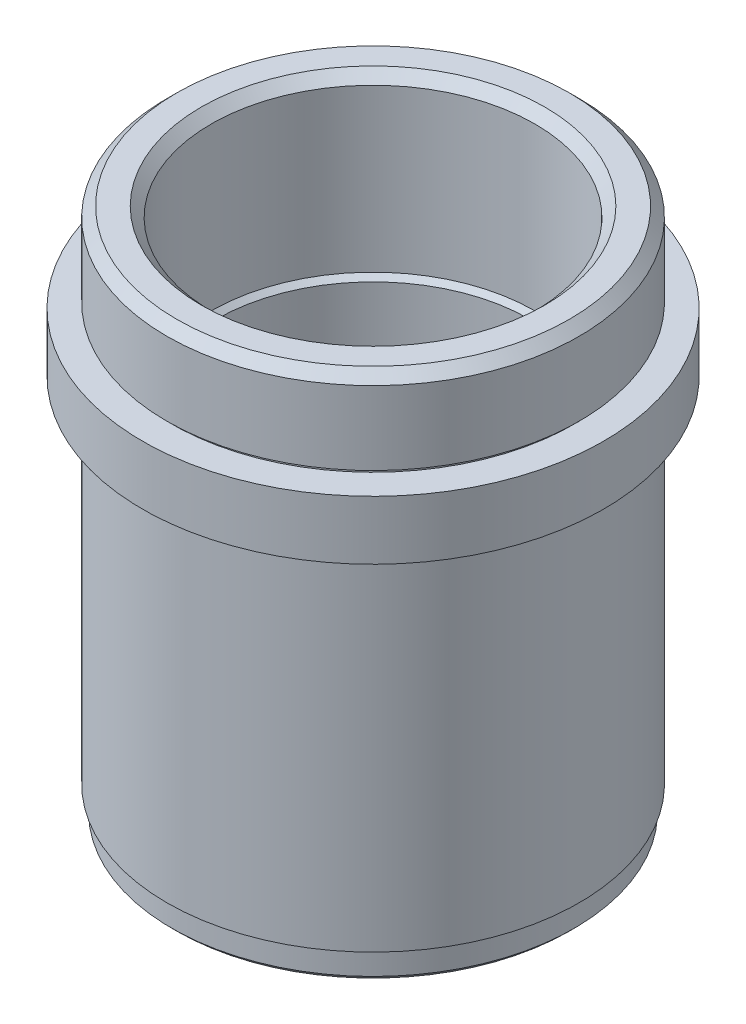
ISO-10303-21;
HEADER;
FILE_DESCRIPTION(('STEP AP214'),'2;1');
FILE_NAME('part.step','',(''),(''),'','','');
FILE_SCHEMA(('AUTOMOTIVE_DESIGN { 1 0 10303 214 1 1 1 1 }'));
ENDSEC;
DATA;
#1=APPLICATION_CONTEXT('core data for automotive mechanical design processes');
#2=APPLICATION_PROTOCOL_DEFINITION('international standard','automotive_design',2000,#1);
#3=PRODUCT_CONTEXT('',#1,'mechanical');
#4=PRODUCT('Part','Part','',(#3));
#5=PRODUCT_RELATED_PRODUCT_CATEGORY('part','',(#4));
#6=PRODUCT_DEFINITION_FORMATION('','',#4);
#7=PRODUCT_DEFINITION_CONTEXT('part definition',#1,'design');
#8=PRODUCT_DEFINITION('design','',#6,#7);
#9=PRODUCT_DEFINITION_SHAPE('','',#8);
#10=(LENGTH_UNIT() NAMED_UNIT(*) SI_UNIT(.MILLI.,.METRE.));
#11=(NAMED_UNIT(*) PLANE_ANGLE_UNIT() SI_UNIT($,.RADIAN.));
#12=(NAMED_UNIT(*) SI_UNIT($,.STERADIAN.) SOLID_ANGLE_UNIT());
#13=UNCERTAINTY_MEASURE_WITH_UNIT(LENGTH_MEASURE(1.E-05),#10,'distance_accuracy_value','');
#14=(GEOMETRIC_REPRESENTATION_CONTEXT(3) GLOBAL_UNCERTAINTY_ASSIGNED_CONTEXT((#13)) GLOBAL_UNIT_ASSIGNED_CONTEXT((#10,
#11,#12)) REPRESENTATION_CONTEXT('',''));
#15=CARTESIAN_POINT('',(0.,0.,0.));
#16=DIRECTION('',(0.,0.,1.));
#17=DIRECTION('',(1.,0.,0.));
#18=AXIS2_PLACEMENT_3D('',#15,#16,#17);
#19=CARTESIAN_POINT('',(0.,58.9953635688833,0.));
#20=DIRECTION('',(0.,1.,0.));
#21=DIRECTION('',(0.,0.,1.));
#22=AXIS2_PLACEMENT_3D('',#19,#20,#21);
#23=CONICAL_SURFACE('',#22,16.5,0.785398163397448);
#24=CARTESIAN_POINT('',(0.,59.9953635688833,0.));
#25=DIRECTION('',(0.,-1.,0.));
#26=DIRECTION('',(0.,0.,-1.));
#27=AXIS2_PLACEMENT_3D('',#24,#25,#26);
#28=CIRCLE('',#27,17.5);
#29=CARTESIAN_POINT('',(0.,59.9953635688833,-17.5));
#30=VERTEX_POINT('',#29);
#31=EDGE_CURVE('E10',#30,#30,#28,.T.);
#32=ORIENTED_EDGE('',*,*,#31,.F.);
#33=EDGE_LOOP('',(#32));
#34=FACE_BOUND('',#33,.T.);
#35=CARTESIAN_POINT('',(0.,58.9953635688833,0.));
#36=DIRECTION('',(0.,-1.,0.));
#37=DIRECTION('',(0.,0.,-1.));
#38=AXIS2_PLACEMENT_3D('',#35,#36,#37);
#39=CIRCLE('',#38,16.5);
#40=CARTESIAN_POINT('',(0.,58.9953635688833,-16.5));
#41=VERTEX_POINT('',#40);
#42=EDGE_CURVE('E92',#41,#41,#39,.T.);
#43=ORIENTED_EDGE('',*,*,#42,.T.);
#44=EDGE_LOOP('',(#43));
#45=FACE_BOUND('',#44,.T.);
#46=ADVANCED_FACE('F31',(#34,#45),#23,.F.);
#47=CARTESIAN_POINT('',(-17.5,59.9953635688833,0.));
#48=DIRECTION('',(0.,-1.,0.));
#49=DIRECTION('',(0.,0.,-1.));
#50=AXIS2_PLACEMENT_3D('',#47,#48,#49);
#51=PLANE('',#50);
#52=CARTESIAN_POINT('',(0.,59.9953635688833,0.));
#53=DIRECTION('',(0.,-1.,0.));
#54=DIRECTION('',(0.,0.,-1.));
#55=AXIS2_PLACEMENT_3D('',#52,#53,#54);
#56=CIRCLE('',#55,20.);
#57=CARTESIAN_POINT('',(0.,59.9953635688833,-20.));
#58=VERTEX_POINT('',#57);
#59=EDGE_CURVE('E37',#58,#58,#56,.T.);
#60=ORIENTED_EDGE('',*,*,#59,.F.);
#61=EDGE_LOOP('',(#60));
#62=FACE_BOUND('',#61,.T.);
#63=ORIENTED_EDGE('',*,*,#31,.T.);
#64=EDGE_LOOP('',(#63));
#65=FACE_BOUND('',#64,.T.);
#66=ADVANCED_FACE('F195',(#62,#65),#51,.F.);
#67=CARTESIAN_POINT('',(0.,59.9953635688833,0.));
#68=DIRECTION('',(0.,-1.,0.));
#69=DIRECTION('',(0.,0.,-1.));
#70=AXIS2_PLACEMENT_3D('',#67,#68,#69);
#71=CONICAL_SURFACE('',#70,20.,0.785398163397448);
#72=CARTESIAN_POINT('',(0.,58.9953635688833,0.));
#73=DIRECTION('',(0.,-1.,0.));
#74=DIRECTION('',(0.,0.,-1.));
#75=AXIS2_PLACEMENT_3D('',#72,#73,#74);
#76=CIRCLE('',#75,21.);
#77=CARTESIAN_POINT('',(0.,58.9953635688833,-21.));
#78=VERTEX_POINT('',#77);
#79=EDGE_CURVE('E41',#78,#78,#76,.T.);
#80=ORIENTED_EDGE('',*,*,#79,.F.);
#81=EDGE_LOOP('',(#80));
#82=FACE_BOUND('',#81,.T.);
#83=ORIENTED_EDGE('',*,*,#59,.T.);
#84=EDGE_LOOP('',(#83));
#85=FACE_BOUND('',#84,.T.);
#86=ADVANCED_FACE('F190',(#82,#85),#71,.T.);
#87=CARTESIAN_POINT('',(0.,0.,0.));
#88=DIRECTION('',(0.,-1.,0.));
#89=DIRECTION('',(0.,0.,-1.));
#90=AXIS2_PLACEMENT_3D('',#87,#88,#89);
#91=CYLINDRICAL_SURFACE('',#90,21.);
#92=CARTESIAN_POINT('',(0.,51.5,0.));
#93=DIRECTION('',(0.,-1.,0.));
#94=DIRECTION('',(0.,0.,-1.));
#95=AXIS2_PLACEMENT_3D('',#92,#93,#94);
#96=CIRCLE('',#95,21.);
#97=CARTESIAN_POINT('',(0.,51.5,-21.));
#98=VERTEX_POINT('',#97);
#99=EDGE_CURVE('E45',#98,#98,#96,.T.);
#100=ORIENTED_EDGE('',*,*,#99,.F.);
#101=EDGE_LOOP('',(#100));
#102=FACE_BOUND('',#101,.T.);
#103=ORIENTED_EDGE('',*,*,#79,.T.);
#104=EDGE_LOOP('',(#103));
#105=FACE_BOUND('',#104,.T.);
#106=ADVANCED_FACE('F184',(#102,#105),#91,.T.);
#107=CARTESIAN_POINT('',(-21.,51.5,0.));
#108=DIRECTION('',(0.,1.,0.));
#109=DIRECTION('',(0.,0.,1.));
#110=AXIS2_PLACEMENT_3D('',#107,#108,#109);
#111=PLANE('',#110);
#112=CARTESIAN_POINT('',(0.,51.5,0.));
#113=DIRECTION('',(0.,-1.,0.));
#114=DIRECTION('',(0.,0.,-1.));
#115=AXIS2_PLACEMENT_3D('',#112,#113,#114);
#116=CIRCLE('',#115,20.5);
#117=CARTESIAN_POINT('',(0.,51.5,-20.5));
#118=VERTEX_POINT('',#117);
#119=EDGE_CURVE('E50',#118,#118,#116,.T.);
#120=ORIENTED_EDGE('',*,*,#119,.F.);
#121=EDGE_LOOP('',(#120));
#122=FACE_BOUND('',#121,.T.);
#123=ORIENTED_EDGE('',*,*,#99,.T.);
#124=EDGE_LOOP('',(#123));
#125=FACE_BOUND('',#124,.T.);
#126=ADVANCED_FACE('F178',(#122,#125),#111,.F.);
#127=CARTESIAN_POINT('',(0.,0.,0.));
#128=DIRECTION('',(0.,-1.,0.));
#129=DIRECTION('',(0.,0.,-1.));
#130=AXIS2_PLACEMENT_3D('',#127,#128,#129);
#131=CYLINDRICAL_SURFACE('',#130,20.5);
#132=CARTESIAN_POINT('',(0.,50.9953635688833,0.));
#133=DIRECTION('',(0.,-1.,0.));
#134=DIRECTION('',(0.,0.,-1.));
#135=AXIS2_PLACEMENT_3D('',#132,#133,#134);
#136=CIRCLE('',#135,20.5);
#137=CARTESIAN_POINT('',(0.,50.9953635688833,-20.5));
#138=VERTEX_POINT('',#137);
#139=EDGE_CURVE('E53',#138,#138,#136,.T.);
#140=ORIENTED_EDGE('',*,*,#139,.F.);
#141=EDGE_LOOP('',(#140));
#142=FACE_BOUND('',#141,.T.);
#143=ORIENTED_EDGE('',*,*,#119,.T.);
#144=EDGE_LOOP('',(#143));
#145=FACE_BOUND('',#144,.T.);
#146=ADVANCED_FACE('F172',(#142,#145),#131,.T.);
#147=CARTESIAN_POINT('',(-20.5,50.9953635688833,0.));
#148=DIRECTION('',(0.,-1.,0.));
#149=DIRECTION('',(0.,0.,-1.));
#150=AXIS2_PLACEMENT_3D('',#147,#148,#149);
#151=PLANE('',#150);
#152=CARTESIAN_POINT('',(0.,50.9953635688833,0.));
#153=DIRECTION('',(0.,-1.,0.));
#154=DIRECTION('',(0.,0.,-1.));
#155=AXIS2_PLACEMENT_3D('',#152,#153,#154);
#156=CIRCLE('',#155,23.5);
#157=CARTESIAN_POINT('',(0.,50.9953635688833,-23.5));
#158=VERTEX_POINT('',#157);
#159=EDGE_CURVE('E56',#158,#158,#156,.T.);
#160=ORIENTED_EDGE('',*,*,#159,.F.);
#161=EDGE_LOOP('',(#160));
#162=FACE_BOUND('',#161,.T.);
#163=ORIENTED_EDGE('',*,*,#139,.T.);
#164=EDGE_LOOP('',(#163));
#165=FACE_BOUND('',#164,.T.);
#166=ADVANCED_FACE('F166',(#162,#165),#151,.F.);
#167=CARTESIAN_POINT('',(0.,0.,0.));
#168=DIRECTION('',(0.,-1.,0.));
#169=DIRECTION('',(0.,0.,-1.));
#170=AXIS2_PLACEMENT_3D('',#167,#168,#169);
#171=CYLINDRICAL_SURFACE('',#170,23.5);
#172=CARTESIAN_POINT('',(0.,44.9953635688833,0.));
#173=DIRECTION('',(0.,-1.,0.));
#174=DIRECTION('',(0.,0.,-1.));
#175=AXIS2_PLACEMENT_3D('',#172,#173,#174);
#176=CIRCLE('',#175,23.5);
#177=CARTESIAN_POINT('',(0.,44.9953635688833,-23.5));
#178=VERTEX_POINT('',#177);
#179=EDGE_CURVE('E59',#178,#178,#176,.T.);
#180=ORIENTED_EDGE('',*,*,#179,.F.);
#181=EDGE_LOOP('',(#180));
#182=FACE_BOUND('',#181,.T.);
#183=ORIENTED_EDGE('',*,*,#159,.T.);
#184=EDGE_LOOP('',(#183));
#185=FACE_BOUND('',#184,.T.);
#186=ADVANCED_FACE('F160',(#182,#185),#171,.T.);
#187=CARTESIAN_POINT('',(-23.5,44.9953635688833,0.));
#188=DIRECTION('',(0.,1.,0.));
#189=DIRECTION('',(0.,0.,1.));
#190=AXIS2_PLACEMENT_3D('',#187,#188,#189);
#191=PLANE('',#190);
#192=CARTESIAN_POINT('',(0.,44.9953635688833,0.));
#193=DIRECTION('',(0.,-1.,0.));
#194=DIRECTION('',(0.,0.,-1.));
#195=AXIS2_PLACEMENT_3D('',#192,#193,#194);
#196=CIRCLE('',#195,20.5);
#197=CARTESIAN_POINT('',(0.,44.9953635688833,-20.5));
#198=VERTEX_POINT('',#197);
#199=EDGE_CURVE('E62',#198,#198,#196,.T.);
#200=ORIENTED_EDGE('',*,*,#199,.F.);
#201=EDGE_LOOP('',(#200));
#202=FACE_BOUND('',#201,.T.);
#203=ORIENTED_EDGE('',*,*,#179,.T.);
#204=EDGE_LOOP('',(#203));
#205=FACE_BOUND('',#204,.T.);
#206=ADVANCED_FACE('F154',(#202,#205),#191,.F.);
#207=CARTESIAN_POINT('',(0.,0.,0.));
#208=DIRECTION('',(0.,-1.,0.));
#209=DIRECTION('',(0.,0.,-1.));
#210=AXIS2_PLACEMENT_3D('',#207,#208,#209);
#211=CYLINDRICAL_SURFACE('',#210,20.5);
#212=CARTESIAN_POINT('',(0.,44.5,0.));
#213=DIRECTION('',(0.,-1.,0.));
#214=DIRECTION('',(0.,0.,-1.));
#215=AXIS2_PLACEMENT_3D('',#212,#213,#214);
#216=CIRCLE('',#215,20.5);
#217=CARTESIAN_POINT('',(0.,44.5,-20.5));
#218=VERTEX_POINT('',#217);
#219=EDGE_CURVE('E65',#218,#218,#216,.T.);
#220=ORIENTED_EDGE('',*,*,#219,.F.);
#221=EDGE_LOOP('',(#220));
#222=FACE_BOUND('',#221,.T.);
#223=ORIENTED_EDGE('',*,*,#199,.T.);
#224=EDGE_LOOP('',(#223));
#225=FACE_BOUND('',#224,.T.);
#226=ADVANCED_FACE('F148',(#222,#225),#211,.T.);
#227=CARTESIAN_POINT('',(-20.5,44.5,0.));
#228=DIRECTION('',(0.,-1.,0.));
#229=DIRECTION('',(0.,0.,-1.));
#230=AXIS2_PLACEMENT_3D('',#227,#228,#229);
#231=PLANE('',#230);
#232=CARTESIAN_POINT('',(0.,44.5,0.));
#233=DIRECTION('',(0.,-1.,0.));
#234=DIRECTION('',(0.,0.,-1.));
#235=AXIS2_PLACEMENT_3D('',#232,#233,#234);
#236=CIRCLE('',#235,21.);
#237=CARTESIAN_POINT('',(0.,44.5,-21.));
#238=VERTEX_POINT('',#237);
#239=EDGE_CURVE('E68',#238,#238,#236,.T.);
#240=ORIENTED_EDGE('',*,*,#239,.F.);
#241=EDGE_LOOP('',(#240));
#242=FACE_BOUND('',#241,.T.);
#243=ORIENTED_EDGE('',*,*,#219,.T.);
#244=EDGE_LOOP('',(#243));
#245=FACE_BOUND('',#244,.T.);
#246=ADVANCED_FACE('F142',(#242,#245),#231,.F.);
#247=CARTESIAN_POINT('',(0.,0.,0.));
#248=DIRECTION('',(0.,-1.,0.));
#249=DIRECTION('',(0.,0.,-1.));
#250=AXIS2_PLACEMENT_3D('',#247,#248,#249);
#251=CYLINDRICAL_SURFACE('',#250,21.);
#252=CARTESIAN_POINT('',(0.,8.99536356888326,0.));
#253=DIRECTION('',(0.,-1.,0.));
#254=DIRECTION('',(0.,0.,-1.));
#255=AXIS2_PLACEMENT_3D('',#252,#253,#254);
#256=CIRCLE('',#255,21.);
#257=CARTESIAN_POINT('',(0.,8.99536356888326,-21.));
#258=VERTEX_POINT('',#257);
#259=EDGE_CURVE('E71',#258,#258,#256,.T.);
#260=ORIENTED_EDGE('',*,*,#259,.F.);
#261=EDGE_LOOP('',(#260));
#262=FACE_BOUND('',#261,.T.);
#263=ORIENTED_EDGE('',*,*,#239,.T.);
#264=EDGE_LOOP('',(#263));
#265=FACE_BOUND('',#264,.T.);
#266=ADVANCED_FACE('F136',(#262,#265),#251,.T.);
#267=CARTESIAN_POINT('',(-21.,8.99536356888326,0.));
#268=DIRECTION('',(0.,1.,0.));
#269=DIRECTION('',(0.,0.,1.));
#270=AXIS2_PLACEMENT_3D('',#267,#268,#269);
#271=PLANE('',#270);
#272=CARTESIAN_POINT('',(0.,8.99536356888326,0.));
#273=DIRECTION('',(0.,-1.,0.));
#274=DIRECTION('',(0.,0.,-1.));
#275=AXIS2_PLACEMENT_3D('',#272,#273,#274);
#276=CIRCLE('',#275,20.5);
#277=CARTESIAN_POINT('',(0.,8.99536356888326,-20.5));
#278=VERTEX_POINT('',#277);
#279=EDGE_CURVE('E74',#278,#278,#276,.T.);
#280=ORIENTED_EDGE('',*,*,#279,.F.);
#281=EDGE_LOOP('',(#280));
#282=FACE_BOUND('',#281,.T.);
#283=ORIENTED_EDGE('',*,*,#259,.T.);
#284=EDGE_LOOP('',(#283));
#285=FACE_BOUND('',#284,.T.);
#286=ADVANCED_FACE('F130',(#282,#285),#271,.F.);
#287=CARTESIAN_POINT('',(0.,0.,0.));
#288=DIRECTION('',(0.,-1.,0.));
#289=DIRECTION('',(0.,0.,-1.));
#290=AXIS2_PLACEMENT_3D('',#287,#288,#289);
#291=CYLINDRICAL_SURFACE('',#290,20.5);
#292=CARTESIAN_POINT('',(0.,6.49536356888326,0.));
#293=DIRECTION('',(0.,-1.,0.));
#294=DIRECTION('',(0.,0.,-1.));
#295=AXIS2_PLACEMENT_3D('',#292,#293,#294);
#296=CIRCLE('',#295,20.5);
#297=CARTESIAN_POINT('',(0.,6.49536356888326,-20.5));
#298=VERTEX_POINT('',#297);
#299=EDGE_CURVE('E77',#298,#298,#296,.T.);
#300=ORIENTED_EDGE('',*,*,#299,.F.);
#301=EDGE_LOOP('',(#300));
#302=FACE_BOUND('',#301,.T.);
#303=ORIENTED_EDGE('',*,*,#279,.T.);
#304=EDGE_LOOP('',(#303));
#305=FACE_BOUND('',#304,.T.);
#306=ADVANCED_FACE('F124',(#302,#305),#291,.T.);
#307=CARTESIAN_POINT('',(0.,6.49536356888326,0.));
#308=DIRECTION('',(0.,1.,0.));
#309=DIRECTION('',(0.,0.,1.));
#310=AXIS2_PLACEMENT_3D('',#307,#308,#309);
#311=CONICAL_SURFACE('',#310,20.5,0.785398163397448);
#312=CARTESIAN_POINT('',(0.,5.99536356888326,0.));
#313=DIRECTION('',(0.,-1.,0.));
#314=DIRECTION('',(0.,0.,-1.));
#315=AXIS2_PLACEMENT_3D('',#312,#313,#314);
#316=CIRCLE('',#315,20.);
#317=CARTESIAN_POINT('',(0.,5.99536356888326,-20.));
#318=VERTEX_POINT('',#317);
#319=EDGE_CURVE('E80',#318,#318,#316,.T.);
#320=ORIENTED_EDGE('',*,*,#319,.F.);
#321=EDGE_LOOP('',(#320));
#322=FACE_BOUND('',#321,.T.);
#323=ORIENTED_EDGE('',*,*,#299,.T.);
#324=EDGE_LOOP('',(#323));
#325=FACE_BOUND('',#324,.T.);
#326=ADVANCED_FACE('F118',(#322,#325),#311,.T.);
#327=CARTESIAN_POINT('',(-20.,5.99536356888326,0.));
#328=DIRECTION('',(0.,1.,0.));
#329=DIRECTION('',(0.,0.,1.));
#330=AXIS2_PLACEMENT_3D('',#327,#328,#329);
#331=PLANE('',#330);
#332=CARTESIAN_POINT('',(0.,5.99536356888326,0.));
#333=DIRECTION('',(0.,-1.,0.));
#334=DIRECTION('',(0.,0.,-1.));
#335=AXIS2_PLACEMENT_3D('',#332,#333,#334);
#336=CIRCLE('',#335,16.);
#337=CARTESIAN_POINT('',(0.,5.99536356888326,-16.));
#338=VERTEX_POINT('',#337);
#339=EDGE_CURVE('E83',#338,#338,#336,.T.);
#340=ORIENTED_EDGE('',*,*,#339,.F.);
#341=EDGE_LOOP('',(#340));
#342=FACE_BOUND('',#341,.T.);
#343=ORIENTED_EDGE('',*,*,#319,.T.);
#344=EDGE_LOOP('',(#343));
#345=FACE_BOUND('',#344,.T.);
#346=ADVANCED_FACE('F112',(#342,#345),#331,.F.);
#347=CARTESIAN_POINT('',(0.,0.,0.));
#348=DIRECTION('',(0.,-1.,0.));
#349=DIRECTION('',(0.,0.,-1.));
#350=AXIS2_PLACEMENT_3D('',#347,#348,#349);
#351=CYLINDRICAL_SURFACE('',#350,16.);
#352=CARTESIAN_POINT('',(0.,41.9953635688833,0.));
#353=DIRECTION('',(0.,-1.,0.));
#354=DIRECTION('',(0.,0.,-1.));
#355=AXIS2_PLACEMENT_3D('',#352,#353,#354);
#356=CIRCLE('',#355,16.);
#357=CARTESIAN_POINT('',(0.,41.9953635688833,-16.));
#358=VERTEX_POINT('',#357);
#359=EDGE_CURVE('E86',#358,#358,#356,.T.);
#360=ORIENTED_EDGE('',*,*,#359,.F.);
#361=EDGE_LOOP('',(#360));
#362=FACE_BOUND('',#361,.T.);
#363=ORIENTED_EDGE('',*,*,#339,.T.);
#364=EDGE_LOOP('',(#363));
#365=FACE_BOUND('',#364,.T.);
#366=ADVANCED_FACE('F106',(#362,#365),#351,.F.);
#367=CARTESIAN_POINT('',(0.,41.9953635688833,0.));
#368=DIRECTION('',(0.,1.,0.));
#369=DIRECTION('',(0.,0.,1.));
#370=AXIS2_PLACEMENT_3D('',#367,#368,#369);
#371=CONICAL_SURFACE('',#370,16.,0.785398163397455);
#372=CARTESIAN_POINT('',(0.,42.4953635688832,0.));
#373=DIRECTION('',(0.,-1.,0.));
#374=DIRECTION('',(0.,0.,-1.));
#375=AXIS2_PLACEMENT_3D('',#372,#373,#374);
#376=CIRCLE('',#375,16.5);
#377=CARTESIAN_POINT('',(0.,42.4953635688832,-16.5));
#378=VERTEX_POINT('',#377);
#379=EDGE_CURVE('E89',#378,#378,#376,.T.);
#380=ORIENTED_EDGE('',*,*,#379,.F.);
#381=EDGE_LOOP('',(#380));
#382=FACE_BOUND('',#381,.T.);
#383=ORIENTED_EDGE('',*,*,#359,.T.);
#384=EDGE_LOOP('',(#383));
#385=FACE_BOUND('',#384,.T.);
#386=ADVANCED_FACE('F100',(#382,#385),#371,.F.);
#387=CARTESIAN_POINT('',(0.,0.,0.));
#388=DIRECTION('',(0.,-1.,0.));
#389=DIRECTION('',(0.,0.,-1.));
#390=AXIS2_PLACEMENT_3D('',#387,#388,#389);
#391=CYLINDRICAL_SURFACE('',#390,16.5);
#392=ORIENTED_EDGE('',*,*,#42,.F.);
#393=EDGE_LOOP('',(#392));
#394=FACE_BOUND('',#393,.T.);
#395=ORIENTED_EDGE('',*,*,#379,.T.);
#396=EDGE_LOOP('',(#395));
#397=FACE_BOUND('',#396,.T.);
#398=ADVANCED_FACE('F97',(#394,#397),#391,.F.);
#399=CLOSED_SHELL('',(#46,#66,#86,#106,#126,#146,#166,#186,#206,#226,#246,#266,#286,#306,#326,
#346,#366,#386,#398));
#400=MANIFOLD_SOLID_BREP('B2',#399);
#401=ADVANCED_BREP_SHAPE_REPRESENTATION('',(#18,#400),#14);
#402=SHAPE_DEFINITION_REPRESENTATION(#9,#401);
ENDSEC;
END-ISO-10303-21;
